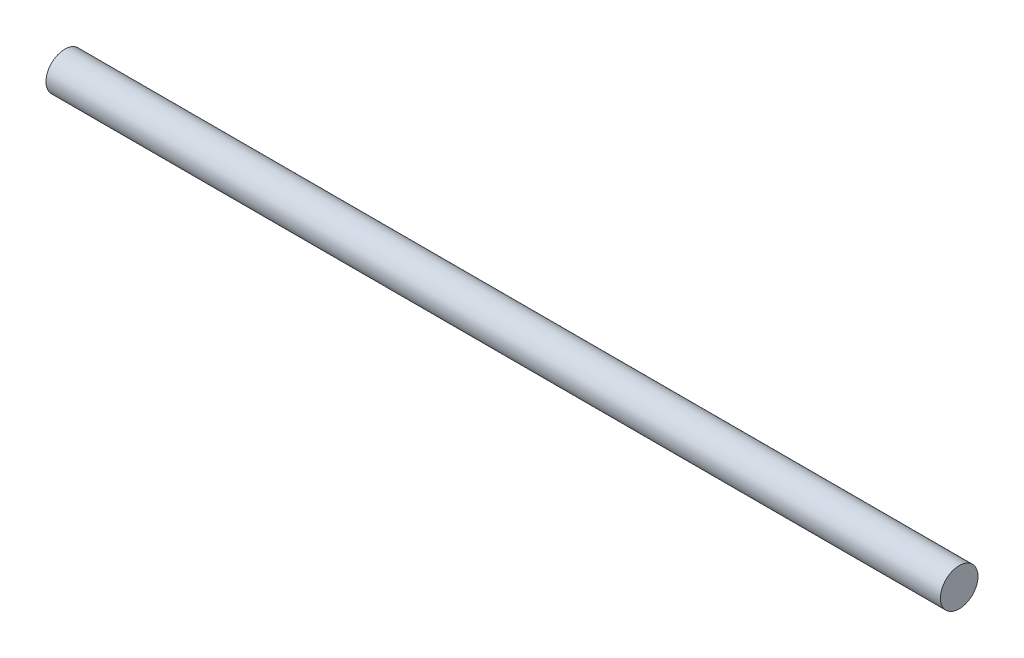
ISO-10303-21;
HEADER;
FILE_DESCRIPTION(('STEP AP214'),'2;1');
FILE_NAME('part.step','',(''),(''),'','','');
FILE_SCHEMA(('AUTOMOTIVE_DESIGN { 1 0 10303 214 1 1 1 1 }'));
ENDSEC;
DATA;
#1=APPLICATION_CONTEXT('core data for automotive mechanical design processes');
#2=APPLICATION_PROTOCOL_DEFINITION('international standard','automotive_design',2000,#1);
#3=PRODUCT_CONTEXT('',#1,'mechanical');
#4=PRODUCT('Part','Part','',(#3));
#5=PRODUCT_RELATED_PRODUCT_CATEGORY('part','',(#4));
#6=PRODUCT_DEFINITION_FORMATION('','',#4);
#7=PRODUCT_DEFINITION_CONTEXT('part definition',#1,'design');
#8=PRODUCT_DEFINITION('design','',#6,#7);
#9=PRODUCT_DEFINITION_SHAPE('','',#8);
#10=(LENGTH_UNIT() NAMED_UNIT(*) SI_UNIT(.MILLI.,.METRE.));
#11=(NAMED_UNIT(*) PLANE_ANGLE_UNIT() SI_UNIT($,.RADIAN.));
#12=(NAMED_UNIT(*) SI_UNIT($,.STERADIAN.) SOLID_ANGLE_UNIT());
#13=UNCERTAINTY_MEASURE_WITH_UNIT(LENGTH_MEASURE(1.E-05),#10,'distance_accuracy_value','');
#14=(GEOMETRIC_REPRESENTATION_CONTEXT(3) GLOBAL_UNCERTAINTY_ASSIGNED_CONTEXT((#13)) GLOBAL_UNIT_ASSIGNED_CONTEXT((#10,
#11,#12)) REPRESENTATION_CONTEXT('',''));
#15=CARTESIAN_POINT('',(0.,0.,0.));
#16=DIRECTION('',(0.,0.,1.));
#17=DIRECTION('',(1.,0.,0.));
#18=AXIS2_PLACEMENT_3D('',#15,#16,#17);
#19=CARTESIAN_POINT('',(29.75,0.,0.));
#20=DIRECTION('',(-1.,0.,0.));
#21=DIRECTION('',(0.,0.,1.));
#22=AXIS2_PLACEMENT_3D('',#19,#20,#21);
#23=CYLINDRICAL_SURFACE('',#22,1.25);
#24=CARTESIAN_POINT('',(29.75,0.,0.));
#25=DIRECTION('',(1.,0.,0.));
#26=DIRECTION('',(0.,0.,-1.));
#27=AXIS2_PLACEMENT_3D('',#24,#25,#26);
#28=CIRCLE('',#27,1.25);
#29=CARTESIAN_POINT('',(29.75,0.,-1.25));
#30=VERTEX_POINT('',#29);
#31=EDGE_CURVE('E10',#30,#30,#28,.T.);
#32=ORIENTED_EDGE('',*,*,#31,.F.);
#33=EDGE_LOOP('',(#32));
#34=FACE_BOUND('',#33,.T.);
#35=CARTESIAN_POINT('',(-29.75,0.,0.));
#36=DIRECTION('',(1.,0.,0.));
#37=DIRECTION('',(0.,0.,-1.));
#38=AXIS2_PLACEMENT_3D('',#35,#36,#37);
#39=CIRCLE('',#38,1.25);
#40=CARTESIAN_POINT('',(-29.75,0.,-1.25));
#41=VERTEX_POINT('',#40);
#42=EDGE_CURVE('E34',#41,#41,#39,.T.);
#43=ORIENTED_EDGE('',*,*,#42,.T.);
#44=EDGE_LOOP('',(#43));
#45=FACE_BOUND('',#44,.T.);
#46=ADVANCED_FACE('F31',(#34,#45),#23,.T.);
#47=CARTESIAN_POINT('',(29.75,0.,0.));
#48=DIRECTION('',(1.,0.,0.));
#49=DIRECTION('',(0.,0.,-1.));
#50=AXIS2_PLACEMENT_3D('',#47,#48,#49);
#51=PLANE('',#50);
#52=ORIENTED_EDGE('',*,*,#31,.T.);
#53=EDGE_LOOP('',(#52));
#54=FACE_BOUND('',#53,.T.);
#55=ADVANCED_FACE('F46',(#54),#51,.T.);
#56=CARTESIAN_POINT('',(-29.75,0.,0.));
#57=DIRECTION('',(1.,0.,0.));
#58=DIRECTION('',(0.,0.,-1.));
#59=AXIS2_PLACEMENT_3D('',#56,#57,#58);
#60=PLANE('',#59);
#61=ORIENTED_EDGE('',*,*,#42,.F.);
#62=EDGE_LOOP('',(#61));
#63=FACE_BOUND('',#62,.T.);
#64=ADVANCED_FACE('F44',(#63),#60,.F.);
#65=CLOSED_SHELL('',(#46,#55,#64));
#66=MANIFOLD_SOLID_BREP('B2',#65);
#67=ADVANCED_BREP_SHAPE_REPRESENTATION('',(#18,#66),#14);
#68=SHAPE_DEFINITION_REPRESENTATION(#9,#67);
ENDSEC;
END-ISO-10303-21;
